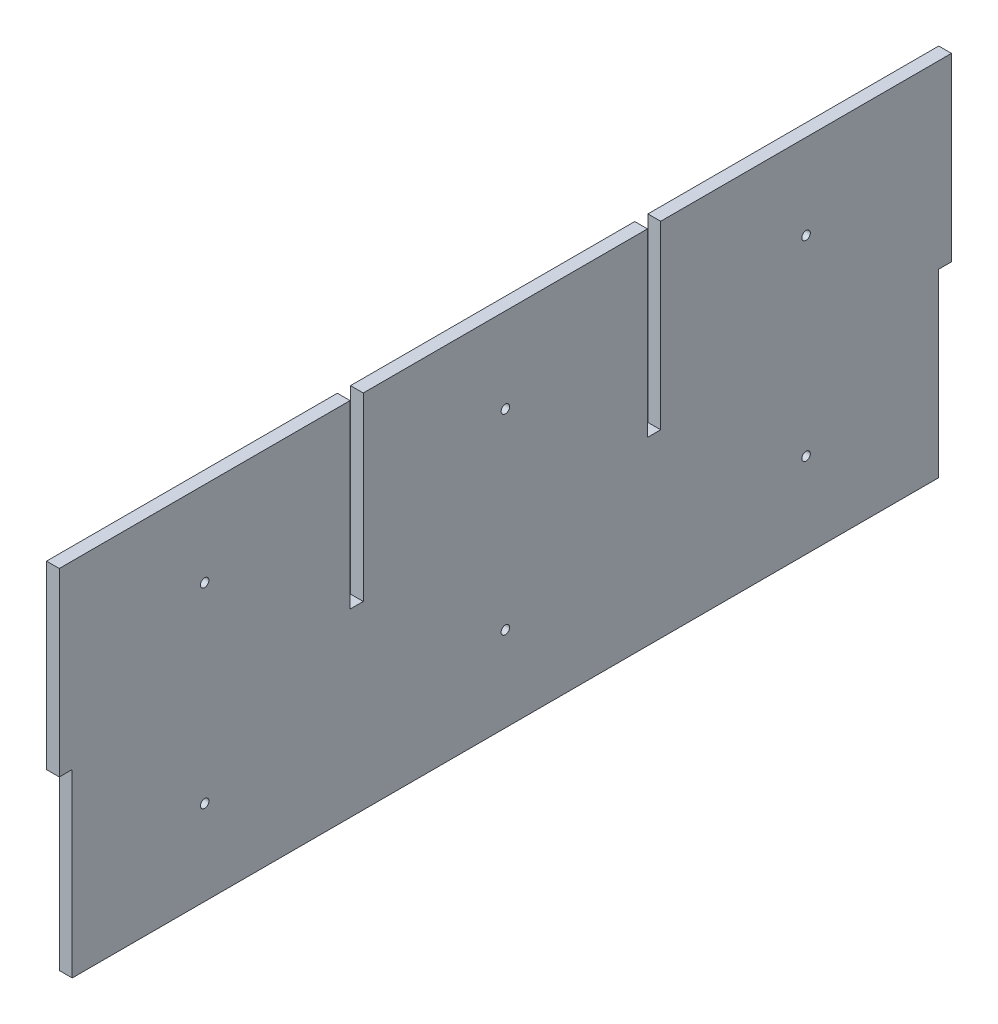
ISO-10303-21;
HEADER;
FILE_DESCRIPTION(('STEP AP214'),'2;1');
FILE_NAME('part.step','',(''),(''),'','','');
FILE_SCHEMA(('AUTOMOTIVE_DESIGN { 1 0 10303 214 1 1 1 1 }'));
ENDSEC;
DATA;
#1=APPLICATION_CONTEXT('core data for automotive mechanical design processes');
#2=APPLICATION_PROTOCOL_DEFINITION('international standard','automotive_design',2000,#1);
#3=PRODUCT_CONTEXT('',#1,'mechanical');
#4=PRODUCT('Part','Part','',(#3));
#5=PRODUCT_RELATED_PRODUCT_CATEGORY('part','',(#4));
#6=PRODUCT_DEFINITION_FORMATION('','',#4);
#7=PRODUCT_DEFINITION_CONTEXT('part definition',#1,'design');
#8=PRODUCT_DEFINITION('design','',#6,#7);
#9=PRODUCT_DEFINITION_SHAPE('','',#8);
#10=(LENGTH_UNIT() NAMED_UNIT(*) SI_UNIT(.MILLI.,.METRE.));
#11=(NAMED_UNIT(*) PLANE_ANGLE_UNIT() SI_UNIT($,.RADIAN.));
#12=(NAMED_UNIT(*) SI_UNIT($,.STERADIAN.) SOLID_ANGLE_UNIT());
#13=UNCERTAINTY_MEASURE_WITH_UNIT(LENGTH_MEASURE(1.E-05),#10,'distance_accuracy_value','');
#14=(GEOMETRIC_REPRESENTATION_CONTEXT(3) GLOBAL_UNCERTAINTY_ASSIGNED_CONTEXT((#13)) GLOBAL_UNIT_ASSIGNED_CONTEXT((#10,
#11,#12)) REPRESENTATION_CONTEXT('',''));
#15=CARTESIAN_POINT('',(0.,0.,0.));
#16=DIRECTION('',(0.,0.,1.));
#17=DIRECTION('',(1.,0.,0.));
#18=AXIS2_PLACEMENT_3D('',#15,#16,#17);
#19=CARTESIAN_POINT('',(6.,246.915861829284,-230.911700257926));
#20=DIRECTION('',(0.,-1.,0.));
#21=DIRECTION('',(0.,0.,-1.));
#22=AXIS2_PLACEMENT_3D('',#19,#20,#21);
#23=PLANE('',#22);
#24=DIRECTION('',(0.,0.,1.));
#25=VECTOR('',#24,1.);
#26=CARTESIAN_POINT('',(6.,246.915861829284,-230.911700257926));
#27=LINE('',#26,#25);
#28=CARTESIAN_POINT('',(6.,246.915861829284,-367.811700257926));
#29=VERTEX_POINT('',#28);
#30=CARTESIAN_POINT('',(6.,246.915861829284,-230.911700257926));
#31=VERTEX_POINT('',#30);
#32=EDGE_CURVE('E188',#29,#31,#27,.T.);
#33=ORIENTED_EDGE('',*,*,#32,.F.);
#34=DIRECTION('',(1.,0.,0.));
#35=VECTOR('',#34,1.);
#36=CARTESIAN_POINT('',(0.,246.915861829284,-367.811700257926));
#37=LINE('',#36,#35);
#38=CARTESIAN_POINT('',(0.,246.915861829284,-367.811700257926));
#39=VERTEX_POINT('',#38);
#40=EDGE_CURVE('E255',#39,#29,#37,.T.);
#41=ORIENTED_EDGE('',*,*,#40,.F.);
#42=DIRECTION('',(0.,0.,1.));
#43=VECTOR('',#42,1.);
#44=CARTESIAN_POINT('',(0.,246.915861829284,-230.911700257926));
#45=LINE('',#44,#43);
#46=CARTESIAN_POINT('',(0.,246.915861829284,-230.911700257926));
#47=VERTEX_POINT('',#46);
#48=EDGE_CURVE('E168',#39,#47,#45,.T.);
#49=ORIENTED_EDGE('',*,*,#48,.T.);
#50=DIRECTION('',(-1.,0.,0.));
#51=VECTOR('',#50,1.);
#52=CARTESIAN_POINT('',(6.,246.915861829284,-230.911700257926));
#53=LINE('',#52,#51);
#54=EDGE_CURVE('E41',#31,#47,#53,.T.);
#55=ORIENTED_EDGE('',*,*,#54,.F.);
#56=EDGE_LOOP('',(#33,#41,#49,#55));
#57=FACE_BOUND('',#56,.T.);
#58=ADVANCED_FACE('F33',(#57),#23,.F.);
#59=CARTESIAN_POINT('',(0.,246.915861829284,-650.911700257926));
#60=VERTEX_POINT('',#59);
#61=CARTESIAN_POINT('',(0.,246.915861829284,-514.011700257926));
#62=VERTEX_POINT('',#61);
#63=EDGE_CURVE('E167',#60,#62,#45,.T.);
#64=ORIENTED_EDGE('',*,*,#63,.T.);
#65=DIRECTION('',(1.,0.,0.));
#66=VECTOR('',#65,1.);
#67=CARTESIAN_POINT('',(0.,246.915861829284,-514.011700257926));
#68=LINE('',#67,#66);
#69=CARTESIAN_POINT('',(6.,246.915861829284,-514.011700257926));
#70=VERTEX_POINT('',#69);
#71=EDGE_CURVE('E221',#62,#70,#68,.T.);
#72=ORIENTED_EDGE('',*,*,#71,.T.);
#73=CARTESIAN_POINT('',(6.,246.915861829284,-650.911700257926));
#74=VERTEX_POINT('',#73);
#75=EDGE_CURVE('E179',#74,#70,#27,.T.);
#76=ORIENTED_EDGE('',*,*,#75,.F.);
#77=DIRECTION('',(-1.,0.,0.));
#78=VECTOR('',#77,1.);
#79=CARTESIAN_POINT('',(6.,246.915861829284,-650.911700257926));
#80=LINE('',#79,#78);
#81=EDGE_CURVE('E11',#74,#60,#80,.T.);
#82=ORIENTED_EDGE('',*,*,#81,.T.);
#83=EDGE_LOOP('',(#64,#72,#76,#82));
#84=FACE_BOUND('',#83,.T.);
#85=ADVANCED_FACE('F374',(#84),#23,.F.);
#86=CARTESIAN_POINT('',(6.,76.915861829284,-230.911700257926));
#87=DIRECTION('',(0.,0.,-1.));
#88=DIRECTION('',(-1.,0.,0.));
#89=AXIS2_PLACEMENT_3D('',#86,#87,#88);
#90=PLANE('',#89);
#91=DIRECTION('',(0.,-1.,0.));
#92=VECTOR('',#91,1.);
#93=CARTESIAN_POINT('',(0.,76.915861829284,-230.911700257926));
#94=LINE('',#93,#92);
#95=CARTESIAN_POINT('',(0.,161.915861829284,-230.911700257926));
#96=VERTEX_POINT('',#95);
#97=EDGE_CURVE('E174',#47,#96,#94,.T.);
#98=ORIENTED_EDGE('',*,*,#97,.T.);
#99=DIRECTION('',(1.,0.,0.));
#100=VECTOR('',#99,1.);
#101=CARTESIAN_POINT('',(0.,161.915861829284,-230.911700257926));
#102=LINE('',#101,#100);
#103=CARTESIAN_POINT('',(6.,161.915861829284,-230.911700257926));
#104=VERTEX_POINT('',#103);
#105=EDGE_CURVE('E207',#96,#104,#102,.T.);
#106=ORIENTED_EDGE('',*,*,#105,.T.);
#107=DIRECTION('',(0.,-1.,0.));
#108=VECTOR('',#107,1.);
#109=CARTESIAN_POINT('',(6.,76.915861829284,-230.911700257926));
#110=LINE('',#109,#108);
#111=EDGE_CURVE('E177',#31,#104,#110,.T.);
#112=ORIENTED_EDGE('',*,*,#111,.F.);
#113=ORIENTED_EDGE('',*,*,#54,.T.);
#114=EDGE_LOOP('',(#98,#106,#112,#113));
#115=FACE_BOUND('',#114,.T.);
#116=ADVANCED_FACE('F35',(#115),#90,.F.);
#117=CARTESIAN_POINT('',(6.,76.915861829284,-230.911700257926));
#118=DIRECTION('',(0.,1.,0.));
#119=DIRECTION('',(0.,0.,1.));
#120=AXIS2_PLACEMENT_3D('',#117,#118,#119);
#121=PLANE('',#120);
#122=DIRECTION('',(0.,0.,-1.));
#123=VECTOR('',#122,1.);
#124=CARTESIAN_POINT('',(0.,76.915861829284,-230.911700257926));
#125=LINE('',#124,#123);
#126=CARTESIAN_POINT('',(0.,76.915861829284,-237.011700257926));
#127=VERTEX_POINT('',#126);
#128=CARTESIAN_POINT('',(0.,76.915861829284,-644.811700257926));
#129=VERTEX_POINT('',#128);
#130=EDGE_CURVE('E169',#127,#129,#125,.T.);
#131=ORIENTED_EDGE('',*,*,#130,.T.);
#132=DIRECTION('',(1.,0.,0.));
#133=VECTOR('',#132,1.);
#134=CARTESIAN_POINT('',(0.,76.915861829284,-644.811700257926));
#135=LINE('',#134,#133);
#136=CARTESIAN_POINT('',(6.,76.915861829284,-644.811700257926));
#137=VERTEX_POINT('',#136);
#138=EDGE_CURVE('E216',#129,#137,#135,.T.);
#139=ORIENTED_EDGE('',*,*,#138,.T.);
#140=DIRECTION('',(0.,0.,-1.));
#141=VECTOR('',#140,1.);
#142=CARTESIAN_POINT('',(6.,76.915861829284,-230.911700257926));
#143=LINE('',#142,#141);
#144=CARTESIAN_POINT('',(6.,76.915861829284,-237.011700257926));
#145=VERTEX_POINT('',#144);
#146=EDGE_CURVE('E197',#145,#137,#143,.T.);
#147=ORIENTED_EDGE('',*,*,#146,.F.);
#148=DIRECTION('',(1.,0.,0.));
#149=VECTOR('',#148,1.);
#150=CARTESIAN_POINT('',(0.,76.915861829284,-237.011700257926));
#151=LINE('',#150,#149);
#152=EDGE_CURVE('E202',#127,#145,#151,.T.);
#153=ORIENTED_EDGE('',*,*,#152,.F.);
#154=EDGE_LOOP('',(#131,#139,#147,#153));
#155=FACE_BOUND('',#154,.T.);
#156=ADVANCED_FACE('F341',(#155),#121,.F.);
#157=CARTESIAN_POINT('',(6.,76.915861829284,-650.911700257926));
#158=DIRECTION('',(0.,0.,1.));
#159=DIRECTION('',(1.,0.,0.));
#160=AXIS2_PLACEMENT_3D('',#157,#158,#159);
#161=PLANE('',#160);
#162=DIRECTION('',(0.,1.,0.));
#163=VECTOR('',#162,1.);
#164=CARTESIAN_POINT('',(6.,76.915861829284,-650.911700257926));
#165=LINE('',#164,#163);
#166=CARTESIAN_POINT('',(6.,161.915861829284,-650.911700257926));
#167=VERTEX_POINT('',#166);
#168=EDGE_CURVE('E161',#167,#74,#165,.T.);
#169=ORIENTED_EDGE('',*,*,#168,.F.);
#170=DIRECTION('',(1.,0.,0.));
#171=VECTOR('',#170,1.);
#172=CARTESIAN_POINT('',(0.,161.915861829284,-650.911700257926));
#173=LINE('',#172,#171);
#174=CARTESIAN_POINT('',(0.,161.915861829284,-650.911700257926));
#175=VERTEX_POINT('',#174);
#176=EDGE_CURVE('E149',#175,#167,#173,.T.);
#177=ORIENTED_EDGE('',*,*,#176,.F.);
#178=DIRECTION('',(0.,1.,0.));
#179=VECTOR('',#178,1.);
#180=CARTESIAN_POINT('',(0.,76.915861829284,-650.911700257926));
#181=LINE('',#180,#179);
#182=EDGE_CURVE('E160',#175,#60,#181,.T.);
#183=ORIENTED_EDGE('',*,*,#182,.T.);
#184=ORIENTED_EDGE('',*,*,#81,.F.);
#185=EDGE_LOOP('',(#169,#177,#183,#184));
#186=FACE_BOUND('',#185,.T.);
#187=ADVANCED_FACE('F158',(#186),#161,.F.);
#188=CARTESIAN_POINT('',(0.,246.915861829284,-507.811700257926));
#189=VERTEX_POINT('',#188);
#190=CARTESIAN_POINT('',(0.,246.915861829284,-374.011700257926));
#191=VERTEX_POINT('',#190);
#192=EDGE_CURVE('E171',#189,#191,#45,.T.);
#193=ORIENTED_EDGE('',*,*,#192,.T.);
#194=DIRECTION('',(1.,0.,0.));
#195=VECTOR('',#194,1.);
#196=CARTESIAN_POINT('',(0.,246.915861829284,-374.011700257926));
#197=LINE('',#196,#195);
#198=CARTESIAN_POINT('',(6.,246.915861829284,-374.011700257926));
#199=VERTEX_POINT('',#198);
#200=EDGE_CURVE('E252',#191,#199,#197,.T.);
#201=ORIENTED_EDGE('',*,*,#200,.T.);
#202=CARTESIAN_POINT('',(6.,246.915861829284,-507.811700257926));
#203=VERTEX_POINT('',#202);
#204=EDGE_CURVE('E186',#203,#199,#27,.T.);
#205=ORIENTED_EDGE('',*,*,#204,.F.);
#206=DIRECTION('',(1.,0.,0.));
#207=VECTOR('',#206,1.);
#208=CARTESIAN_POINT('',(0.,246.915861829284,-507.811700257926));
#209=LINE('',#208,#207);
#210=EDGE_CURVE('E224',#189,#203,#209,.T.);
#211=ORIENTED_EDGE('',*,*,#210,.F.);
#212=EDGE_LOOP('',(#193,#201,#205,#211));
#213=FACE_BOUND('',#212,.T.);
#214=ADVANCED_FACE('F327',(#213),#23,.F.);
#215=CARTESIAN_POINT('',(6.,0.,0.));
#216=DIRECTION('',(-1.,0.,0.));
#217=DIRECTION('',(0.,0.,1.));
#218=AXIS2_PLACEMENT_3D('',#215,#216,#217);
#219=PLANE('',#218);
#220=CARTESIAN_POINT('',(6.,116.915861829284,-440.911700257926));
#221=DIRECTION('',(1.,0.,0.));
#222=DIRECTION('',(0.,0.,-1.));
#223=AXIS2_PLACEMENT_3D('',#220,#221,#222);
#224=CIRCLE('',#223,2.);
#225=CARTESIAN_POINT('',(6.,116.915861829284,-442.911700257926));
#226=VERTEX_POINT('',#225);
#227=EDGE_CURVE('E296',#226,#226,#224,.T.);
#228=ORIENTED_EDGE('',*,*,#227,.F.);
#229=EDGE_LOOP('',(#228));
#230=FACE_BOUND('',#229,.T.);
#231=CARTESIAN_POINT('',(6.,116.915861829284,-582.461700257926));
#232=DIRECTION('',(1.,0.,0.));
#233=DIRECTION('',(0.,0.,-1.));
#234=AXIS2_PLACEMENT_3D('',#231,#232,#233);
#235=CIRCLE('',#234,2.);
#236=CARTESIAN_POINT('',(6.,116.915861829284,-584.461700257926));
#237=VERTEX_POINT('',#236);
#238=EDGE_CURVE('E302',#237,#237,#235,.T.);
#239=ORIENTED_EDGE('',*,*,#238,.F.);
#240=EDGE_LOOP('',(#239));
#241=FACE_BOUND('',#240,.T.);
#242=CARTESIAN_POINT('',(6.,206.915861829284,-582.461700257926));
#243=DIRECTION('',(1.,0.,0.));
#244=DIRECTION('',(0.,0.,-1.));
#245=AXIS2_PLACEMENT_3D('',#242,#243,#244);
#246=CIRCLE('',#245,2.);
#247=CARTESIAN_POINT('',(6.,206.915861829284,-584.461700257926));
#248=VERTEX_POINT('',#247);
#249=EDGE_CURVE('E308',#248,#248,#246,.T.);
#250=ORIENTED_EDGE('',*,*,#249,.F.);
#251=EDGE_LOOP('',(#250));
#252=FACE_BOUND('',#251,.T.);
#253=CARTESIAN_POINT('',(6.,206.915861829284,-440.911700257926));
#254=DIRECTION('',(1.,0.,0.));
#255=DIRECTION('',(0.,0.,-1.));
#256=AXIS2_PLACEMENT_3D('',#253,#254,#255);
#257=CIRCLE('',#256,2.);
#258=CARTESIAN_POINT('',(6.,206.915861829284,-442.911700257926));
#259=VERTEX_POINT('',#258);
#260=EDGE_CURVE('E284',#259,#259,#257,.T.);
#261=ORIENTED_EDGE('',*,*,#260,.F.);
#262=EDGE_LOOP('',(#261));
#263=FACE_BOUND('',#262,.T.);
#264=CARTESIAN_POINT('',(6.,116.915861829284,-299.361700257926));
#265=DIRECTION('',(1.,0.,0.));
#266=DIRECTION('',(0.,0.,-1.));
#267=AXIS2_PLACEMENT_3D('',#264,#265,#266);
#268=CIRCLE('',#267,2.);
#269=CARTESIAN_POINT('',(6.,116.915861829284,-301.361700257926));
#270=VERTEX_POINT('',#269);
#271=EDGE_CURVE('E291',#270,#270,#268,.T.);
#272=ORIENTED_EDGE('',*,*,#271,.F.);
#273=EDGE_LOOP('',(#272));
#274=FACE_BOUND('',#273,.T.);
#275=CARTESIAN_POINT('',(6.,206.915861829284,-299.361700257926));
#276=DIRECTION('',(1.,0.,0.));
#277=DIRECTION('',(0.,0.,-1.));
#278=AXIS2_PLACEMENT_3D('',#275,#276,#277);
#279=CIRCLE('',#278,2.);
#280=CARTESIAN_POINT('',(6.,206.915861829284,-301.361700257926));
#281=VERTEX_POINT('',#280);
#282=EDGE_CURVE('E278',#281,#281,#279,.T.);
#283=ORIENTED_EDGE('',*,*,#282,.F.);
#284=EDGE_LOOP('',(#283));
#285=FACE_BOUND('',#284,.T.);
#286=ORIENTED_EDGE('',*,*,#146,.T.);
#287=DIRECTION('',(0.,-1.,0.));
#288=VECTOR('',#287,1.);
#289=CARTESIAN_POINT('',(6.,161.915861829284,-644.811700257926));
#290=LINE('',#289,#288);
#291=CARTESIAN_POINT('',(6.,161.915861829284,-644.811700257926));
#292=VERTEX_POINT('',#291);
#293=EDGE_CURVE('E154',#292,#137,#290,.T.);
#294=ORIENTED_EDGE('',*,*,#293,.F.);
#295=DIRECTION('',(0.,0.,1.));
#296=VECTOR('',#295,1.);
#297=CARTESIAN_POINT('',(6.,161.915861829284,-650.911700257926));
#298=LINE('',#297,#296);
#299=EDGE_CURVE('E257',#167,#292,#298,.T.);
#300=ORIENTED_EDGE('',*,*,#299,.F.);
#301=ORIENTED_EDGE('',*,*,#168,.T.);
#302=ORIENTED_EDGE('',*,*,#75,.T.);
#303=DIRECTION('',(0.,1.,0.));
#304=VECTOR('',#303,1.);
#305=CARTESIAN_POINT('',(6.,246.915861829284,-514.011700257926));
#306=LINE('',#305,#304);
#307=CARTESIAN_POINT('',(6.,161.915861829284,-514.011700257926));
#308=VERTEX_POINT('',#307);
#309=EDGE_CURVE('E239',#308,#70,#306,.T.);
#310=ORIENTED_EDGE('',*,*,#309,.F.);
#311=DIRECTION('',(0.,0.,-1.));
#312=VECTOR('',#311,1.);
#313=CARTESIAN_POINT('',(6.,161.915861829284,-514.011700257926));
#314=LINE('',#313,#312);
#315=CARTESIAN_POINT('',(6.,161.915861829284,-507.811700257926));
#316=VERTEX_POINT('',#315);
#317=EDGE_CURVE('E232',#316,#308,#314,.T.);
#318=ORIENTED_EDGE('',*,*,#317,.F.);
#319=DIRECTION('',(0.,-1.,0.));
#320=VECTOR('',#319,1.);
#321=CARTESIAN_POINT('',(6.,246.915861829284,-507.811700257926));
#322=LINE('',#321,#320);
#323=EDGE_CURVE('E236',#203,#316,#322,.T.);
#324=ORIENTED_EDGE('',*,*,#323,.F.);
#325=ORIENTED_EDGE('',*,*,#204,.T.);
#326=DIRECTION('',(0.,1.,0.));
#327=VECTOR('',#326,1.);
#328=CARTESIAN_POINT('',(6.,246.915861829284,-374.011700257926));
#329=LINE('',#328,#327);
#330=CARTESIAN_POINT('',(6.,161.915861829284,-374.011700257926));
#331=VERTEX_POINT('',#330);
#332=EDGE_CURVE('E258',#331,#199,#329,.T.);
#333=ORIENTED_EDGE('',*,*,#332,.F.);
#334=DIRECTION('',(0.,0.,-1.));
#335=VECTOR('',#334,1.);
#336=CARTESIAN_POINT('',(6.,161.915861829284,-367.811700257926));
#337=LINE('',#336,#335);
#338=CARTESIAN_POINT('',(6.,161.915861829284,-367.811700257926));
#339=VERTEX_POINT('',#338);
#340=EDGE_CURVE('E261',#339,#331,#337,.T.);
#341=ORIENTED_EDGE('',*,*,#340,.F.);
#342=DIRECTION('',(0.,-1.,0.));
#343=VECTOR('',#342,1.);
#344=CARTESIAN_POINT('',(6.,246.915861829284,-367.811700257926));
#345=LINE('',#344,#343);
#346=EDGE_CURVE('E231',#29,#339,#345,.T.);
#347=ORIENTED_EDGE('',*,*,#346,.F.);
#348=ORIENTED_EDGE('',*,*,#32,.T.);
#349=ORIENTED_EDGE('',*,*,#111,.T.);
#350=DIRECTION('',(0.,0.,1.));
#351=VECTOR('',#350,1.);
#352=CARTESIAN_POINT('',(6.,161.915861829284,-230.911700257926));
#353=LINE('',#352,#351);
#354=CARTESIAN_POINT('',(6.,161.915861829284,-237.011700257926));
#355=VERTEX_POINT('',#354);
#356=EDGE_CURVE('E210',#355,#104,#353,.T.);
#357=ORIENTED_EDGE('',*,*,#356,.F.);
#358=DIRECTION('',(0.,1.,0.));
#359=VECTOR('',#358,1.);
#360=CARTESIAN_POINT('',(6.,161.915861829284,-237.011700257926));
#361=LINE('',#360,#359);
#362=EDGE_CURVE('E213',#145,#355,#361,.T.);
#363=ORIENTED_EDGE('',*,*,#362,.F.);
#364=EDGE_LOOP('',(#286,#294,#300,#301,#302,#310,#318,#324,#325,#333,#341,#347,#348,#349,#357,#363));
#365=FACE_BOUND('',#364,.T.);
#366=ADVANCED_FACE('F324',(#230,#241,#252,#263,#274,#285,#365),#219,.F.);
#367=CARTESIAN_POINT('',(0.,0.,0.));
#368=DIRECTION('',(-1.,0.,0.));
#369=DIRECTION('',(0.,0.,1.));
#370=AXIS2_PLACEMENT_3D('',#367,#368,#369);
#371=PLANE('',#370);
#372=CARTESIAN_POINT('',(0.,116.915861829284,-440.911700257926));
#373=DIRECTION('',(1.,0.,0.));
#374=DIRECTION('',(0.,0.,-1.));
#375=AXIS2_PLACEMENT_3D('',#372,#373,#374);
#376=CIRCLE('',#375,2.);
#377=CARTESIAN_POINT('',(0.,116.915861829284,-442.911700257926));
#378=VERTEX_POINT('',#377);
#379=EDGE_CURVE('E299',#378,#378,#376,.T.);
#380=ORIENTED_EDGE('',*,*,#379,.T.);
#381=EDGE_LOOP('',(#380));
#382=FACE_BOUND('',#381,.T.);
#383=CARTESIAN_POINT('',(0.,116.915861829284,-582.461700257926));
#384=DIRECTION('',(1.,0.,0.));
#385=DIRECTION('',(0.,0.,-1.));
#386=AXIS2_PLACEMENT_3D('',#383,#384,#385);
#387=CIRCLE('',#386,2.);
#388=CARTESIAN_POINT('',(0.,116.915861829284,-584.461700257926));
#389=VERTEX_POINT('',#388);
#390=EDGE_CURVE('E305',#389,#389,#387,.T.);
#391=ORIENTED_EDGE('',*,*,#390,.T.);
#392=EDGE_LOOP('',(#391));
#393=FACE_BOUND('',#392,.T.);
#394=CARTESIAN_POINT('',(0.,206.915861829284,-582.461700257926));
#395=DIRECTION('',(1.,0.,0.));
#396=DIRECTION('',(0.,0.,-1.));
#397=AXIS2_PLACEMENT_3D('',#394,#395,#396);
#398=CIRCLE('',#397,2.);
#399=CARTESIAN_POINT('',(0.,206.915861829284,-584.461700257926));
#400=VERTEX_POINT('',#399);
#401=EDGE_CURVE('E288',#400,#400,#398,.T.);
#402=ORIENTED_EDGE('',*,*,#401,.T.);
#403=EDGE_LOOP('',(#402));
#404=FACE_BOUND('',#403,.T.);
#405=CARTESIAN_POINT('',(0.,206.915861829284,-440.911700257926));
#406=DIRECTION('',(1.,0.,0.));
#407=DIRECTION('',(0.,0.,-1.));
#408=AXIS2_PLACEMENT_3D('',#405,#406,#407);
#409=CIRCLE('',#408,2.);
#410=CARTESIAN_POINT('',(0.,206.915861829284,-442.911700257926));
#411=VERTEX_POINT('',#410);
#412=EDGE_CURVE('E287',#411,#411,#409,.T.);
#413=ORIENTED_EDGE('',*,*,#412,.T.);
#414=EDGE_LOOP('',(#413));
#415=FACE_BOUND('',#414,.T.);
#416=CARTESIAN_POINT('',(0.,116.915861829284,-299.361700257926));
#417=DIRECTION('',(1.,0.,0.));
#418=DIRECTION('',(0.,0.,-1.));
#419=AXIS2_PLACEMENT_3D('',#416,#417,#418);
#420=CIRCLE('',#419,2.);
#421=CARTESIAN_POINT('',(0.,116.915861829284,-301.361700257926));
#422=VERTEX_POINT('',#421);
#423=EDGE_CURVE('E281',#422,#422,#420,.T.);
#424=ORIENTED_EDGE('',*,*,#423,.T.);
#425=EDGE_LOOP('',(#424));
#426=FACE_BOUND('',#425,.T.);
#427=CARTESIAN_POINT('',(0.,206.915861829284,-299.361700257926));
#428=DIRECTION('',(1.,0.,0.));
#429=DIRECTION('',(0.,0.,-1.));
#430=AXIS2_PLACEMENT_3D('',#427,#428,#429);
#431=CIRCLE('',#430,2.);
#432=CARTESIAN_POINT('',(0.,206.915861829284,-301.361700257926));
#433=VERTEX_POINT('',#432);
#434=EDGE_CURVE('E241',#433,#433,#431,.T.);
#435=ORIENTED_EDGE('',*,*,#434,.T.);
#436=EDGE_LOOP('',(#435));
#437=FACE_BOUND('',#436,.T.);
#438=DIRECTION('',(0.,-1.,0.));
#439=VECTOR('',#438,1.);
#440=CARTESIAN_POINT('',(0.,161.915861829284,-644.811700257926));
#441=LINE('',#440,#439);
#442=CARTESIAN_POINT('',(0.,161.915861829284,-644.811700257926));
#443=VERTEX_POINT('',#442);
#444=EDGE_CURVE('E48',#443,#129,#441,.T.);
#445=ORIENTED_EDGE('',*,*,#444,.T.);
#446=ORIENTED_EDGE('',*,*,#130,.F.);
#447=DIRECTION('',(0.,1.,0.));
#448=VECTOR('',#447,1.);
#449=CARTESIAN_POINT('',(0.,161.915861829284,-237.011700257926));
#450=LINE('',#449,#448);
#451=CARTESIAN_POINT('',(0.,161.915861829284,-237.011700257926));
#452=VERTEX_POINT('',#451);
#453=EDGE_CURVE('E212',#127,#452,#450,.T.);
#454=ORIENTED_EDGE('',*,*,#453,.T.);
#455=DIRECTION('',(0.,0.,1.));
#456=VECTOR('',#455,1.);
#457=CARTESIAN_POINT('',(0.,161.915861829284,-230.911700257926));
#458=LINE('',#457,#456);
#459=EDGE_CURVE('E205',#452,#96,#458,.T.);
#460=ORIENTED_EDGE('',*,*,#459,.T.);
#461=ORIENTED_EDGE('',*,*,#97,.F.);
#462=ORIENTED_EDGE('',*,*,#48,.F.);
#463=DIRECTION('',(0.,-1.,0.));
#464=VECTOR('',#463,1.);
#465=CARTESIAN_POINT('',(0.,246.915861829284,-367.811700257926));
#466=LINE('',#465,#464);
#467=CARTESIAN_POINT('',(0.,161.915861829284,-367.811700257926));
#468=VERTEX_POINT('',#467);
#469=EDGE_CURVE('E260',#39,#468,#466,.T.);
#470=ORIENTED_EDGE('',*,*,#469,.T.);
#471=DIRECTION('',(0.,0.,-1.));
#472=VECTOR('',#471,1.);
#473=CARTESIAN_POINT('',(0.,161.915861829284,-367.811700257926));
#474=LINE('',#473,#472);
#475=CARTESIAN_POINT('',(0.,161.915861829284,-374.011700257926));
#476=VERTEX_POINT('',#475);
#477=EDGE_CURVE('E267',#468,#476,#474,.T.);
#478=ORIENTED_EDGE('',*,*,#477,.T.);
#479=DIRECTION('',(0.,1.,0.));
#480=VECTOR('',#479,1.);
#481=CARTESIAN_POINT('',(0.,246.915861829284,-374.011700257926));
#482=LINE('',#481,#480);
#483=EDGE_CURVE('E56',#476,#191,#482,.T.);
#484=ORIENTED_EDGE('',*,*,#483,.T.);
#485=ORIENTED_EDGE('',*,*,#192,.F.);
#486=DIRECTION('',(0.,-1.,0.));
#487=VECTOR('',#486,1.);
#488=CARTESIAN_POINT('',(0.,246.915861829284,-507.811700257926));
#489=LINE('',#488,#487);
#490=CARTESIAN_POINT('',(0.,161.915861829284,-507.811700257926));
#491=VERTEX_POINT('',#490);
#492=EDGE_CURVE('E244',#189,#491,#489,.T.);
#493=ORIENTED_EDGE('',*,*,#492,.T.);
#494=DIRECTION('',(0.,0.,-1.));
#495=VECTOR('',#494,1.);
#496=CARTESIAN_POINT('',(0.,161.915861829284,-514.011700257926));
#497=LINE('',#496,#495);
#498=CARTESIAN_POINT('',(0.,161.915861829284,-514.011700257926));
#499=VERTEX_POINT('',#498);
#500=EDGE_CURVE('E225',#491,#499,#497,.T.);
#501=ORIENTED_EDGE('',*,*,#500,.T.);
#502=DIRECTION('',(0.,1.,0.));
#503=VECTOR('',#502,1.);
#504=CARTESIAN_POINT('',(0.,246.915861829284,-514.011700257926));
#505=LINE('',#504,#503);
#506=EDGE_CURVE('E235',#499,#62,#505,.T.);
#507=ORIENTED_EDGE('',*,*,#506,.T.);
#508=ORIENTED_EDGE('',*,*,#63,.F.);
#509=ORIENTED_EDGE('',*,*,#182,.F.);
#510=DIRECTION('',(0.,0.,1.));
#511=VECTOR('',#510,1.);
#512=CARTESIAN_POINT('',(0.,161.915861829284,-650.911700257926));
#513=LINE('',#512,#511);
#514=EDGE_CURVE('E145',#175,#443,#513,.T.);
#515=ORIENTED_EDGE('',*,*,#514,.T.);
#516=EDGE_LOOP('',(#445,#446,#454,#460,#461,#462,#470,#478,#484,#485,#493,#501,#507,#508,#509,#515));
#517=FACE_BOUND('',#516,.T.);
#518=ADVANCED_FACE('F164',(#382,#393,#404,#415,#426,#437,#517),#371,.T.);
#519=CARTESIAN_POINT('',(0.,161.915861829284,-230.911700257926));
#520=DIRECTION('',(0.,1.,0.));
#521=DIRECTION('',(0.,0.,1.));
#522=AXIS2_PLACEMENT_3D('',#519,#520,#521);
#523=PLANE('',#522);
#524=ORIENTED_EDGE('',*,*,#356,.T.);
#525=ORIENTED_EDGE('',*,*,#105,.F.);
#526=ORIENTED_EDGE('',*,*,#459,.F.);
#527=DIRECTION('',(1.,0.,0.));
#528=VECTOR('',#527,1.);
#529=CARTESIAN_POINT('',(0.,161.915861829284,-237.011700257926));
#530=LINE('',#529,#528);
#531=EDGE_CURVE('E204',#452,#355,#530,.T.);
#532=ORIENTED_EDGE('',*,*,#531,.T.);
#533=EDGE_LOOP('',(#524,#525,#526,#532));
#534=FACE_BOUND('',#533,.T.);
#535=ADVANCED_FACE('F348',(#534),#523,.F.);
#536=CARTESIAN_POINT('',(0.,161.915861829284,-237.011700257926));
#537=DIRECTION('',(0.,0.,-1.));
#538=DIRECTION('',(0.,1.,0.));
#539=AXIS2_PLACEMENT_3D('',#536,#537,#538);
#540=PLANE('',#539);
#541=ORIENTED_EDGE('',*,*,#362,.T.);
#542=ORIENTED_EDGE('',*,*,#531,.F.);
#543=ORIENTED_EDGE('',*,*,#453,.F.);
#544=ORIENTED_EDGE('',*,*,#152,.T.);
#545=EDGE_LOOP('',(#541,#542,#543,#544));
#546=FACE_BOUND('',#545,.T.);
#547=ADVANCED_FACE('F346',(#546),#540,.F.);
#548=CARTESIAN_POINT('',(0.,246.915861829284,-514.011700257926));
#549=DIRECTION('',(0.,0.,-1.));
#550=DIRECTION('',(0.,1.,0.));
#551=AXIS2_PLACEMENT_3D('',#548,#549,#550);
#552=PLANE('',#551);
#553=ORIENTED_EDGE('',*,*,#309,.T.);
#554=ORIENTED_EDGE('',*,*,#71,.F.);
#555=ORIENTED_EDGE('',*,*,#506,.F.);
#556=DIRECTION('',(1.,0.,0.));
#557=VECTOR('',#556,1.);
#558=CARTESIAN_POINT('',(0.,161.915861829284,-514.011700257926));
#559=LINE('',#558,#557);
#560=EDGE_CURVE('E229',#499,#308,#559,.T.);
#561=ORIENTED_EDGE('',*,*,#560,.T.);
#562=EDGE_LOOP('',(#553,#554,#555,#561));
#563=FACE_BOUND('',#562,.T.);
#564=ADVANCED_FACE('F375',(#563),#552,.F.);
#565=CARTESIAN_POINT('',(0.,161.915861829284,-514.011700257926));
#566=DIRECTION('',(0.,-1.,0.));
#567=DIRECTION('',(0.,0.,-1.));
#568=AXIS2_PLACEMENT_3D('',#565,#566,#567);
#569=PLANE('',#568);
#570=ORIENTED_EDGE('',*,*,#317,.T.);
#571=ORIENTED_EDGE('',*,*,#560,.F.);
#572=ORIENTED_EDGE('',*,*,#500,.F.);
#573=DIRECTION('',(1.,0.,0.));
#574=VECTOR('',#573,1.);
#575=CARTESIAN_POINT('',(0.,161.915861829284,-507.811700257926));
#576=LINE('',#575,#574);
#577=EDGE_CURVE('E227',#491,#316,#576,.T.);
#578=ORIENTED_EDGE('',*,*,#577,.T.);
#579=EDGE_LOOP('',(#570,#571,#572,#578));
#580=FACE_BOUND('',#579,.T.);
#581=ADVANCED_FACE('F370',(#580),#569,.F.);
#582=CARTESIAN_POINT('',(0.,246.915861829284,-507.811700257926));
#583=DIRECTION('',(0.,0.,1.));
#584=DIRECTION('',(0.,-1.,0.));
#585=AXIS2_PLACEMENT_3D('',#582,#583,#584);
#586=PLANE('',#585);
#587=ORIENTED_EDGE('',*,*,#323,.T.);
#588=ORIENTED_EDGE('',*,*,#577,.F.);
#589=ORIENTED_EDGE('',*,*,#492,.F.);
#590=ORIENTED_EDGE('',*,*,#210,.T.);
#591=EDGE_LOOP('',(#587,#588,#589,#590));
#592=FACE_BOUND('',#591,.T.);
#593=ADVANCED_FACE('F366',(#592),#586,.F.);
#594=CARTESIAN_POINT('',(0.,246.915861829284,-367.811700257926));
#595=DIRECTION('',(0.,0.,1.));
#596=DIRECTION('',(1.,0.,0.));
#597=AXIS2_PLACEMENT_3D('',#594,#595,#596);
#598=PLANE('',#597);
#599=ORIENTED_EDGE('',*,*,#346,.T.);
#600=DIRECTION('',(1.,0.,0.));
#601=VECTOR('',#600,1.);
#602=CARTESIAN_POINT('',(0.,161.915861829284,-367.811700257926));
#603=LINE('',#602,#601);
#604=EDGE_CURVE('E248',#468,#339,#603,.T.);
#605=ORIENTED_EDGE('',*,*,#604,.F.);
#606=ORIENTED_EDGE('',*,*,#469,.F.);
#607=ORIENTED_EDGE('',*,*,#40,.T.);
#608=EDGE_LOOP('',(#599,#605,#606,#607));
#609=FACE_BOUND('',#608,.T.);
#610=ADVANCED_FACE('F353',(#609),#598,.F.);
#611=CARTESIAN_POINT('',(0.,246.915861829284,-374.011700257926));
#612=DIRECTION('',(0.,0.,-1.));
#613=DIRECTION('',(-1.,0.,0.));
#614=AXIS2_PLACEMENT_3D('',#611,#612,#613);
#615=PLANE('',#614);
#616=ORIENTED_EDGE('',*,*,#332,.T.);
#617=ORIENTED_EDGE('',*,*,#200,.F.);
#618=ORIENTED_EDGE('',*,*,#483,.F.);
#619=DIRECTION('',(1.,0.,0.));
#620=VECTOR('',#619,1.);
#621=CARTESIAN_POINT('',(0.,161.915861829284,-374.011700257926));
#622=LINE('',#621,#620);
#623=EDGE_CURVE('E250',#476,#331,#622,.T.);
#624=ORIENTED_EDGE('',*,*,#623,.T.);
#625=EDGE_LOOP('',(#616,#617,#618,#624));
#626=FACE_BOUND('',#625,.T.);
#627=ADVANCED_FACE('F450',(#626),#615,.F.);
#628=CARTESIAN_POINT('',(0.,161.915861829284,-367.811700257926));
#629=DIRECTION('',(0.,-1.,0.));
#630=DIRECTION('',(0.,0.,-1.));
#631=AXIS2_PLACEMENT_3D('',#628,#629,#630);
#632=PLANE('',#631);
#633=ORIENTED_EDGE('',*,*,#340,.T.);
#634=ORIENTED_EDGE('',*,*,#623,.F.);
#635=ORIENTED_EDGE('',*,*,#477,.F.);
#636=ORIENTED_EDGE('',*,*,#604,.T.);
#637=EDGE_LOOP('',(#633,#634,#635,#636));
#638=FACE_BOUND('',#637,.T.);
#639=ADVANCED_FACE('F357',(#638),#632,.F.);
#640=CARTESIAN_POINT('',(0.,161.915861829284,-644.811700257926));
#641=DIRECTION('',(0.,0.,1.));
#642=DIRECTION('',(1.,0.,0.));
#643=AXIS2_PLACEMENT_3D('',#640,#641,#642);
#644=PLANE('',#643);
#645=ORIENTED_EDGE('',*,*,#293,.T.);
#646=ORIENTED_EDGE('',*,*,#138,.F.);
#647=ORIENTED_EDGE('',*,*,#444,.F.);
#648=DIRECTION('',(1.,0.,0.));
#649=VECTOR('',#648,1.);
#650=CARTESIAN_POINT('',(0.,161.915861829284,-644.811700257926));
#651=LINE('',#650,#649);
#652=EDGE_CURVE('E151',#443,#292,#651,.T.);
#653=ORIENTED_EDGE('',*,*,#652,.T.);
#654=EDGE_LOOP('',(#645,#646,#647,#653));
#655=FACE_BOUND('',#654,.T.);
#656=ADVANCED_FACE('F343',(#655),#644,.F.);
#657=CARTESIAN_POINT('',(0.,161.915861829284,-650.911700257926));
#658=DIRECTION('',(0.,1.,0.));
#659=DIRECTION('',(0.,0.,1.));
#660=AXIS2_PLACEMENT_3D('',#657,#658,#659);
#661=PLANE('',#660);
#662=ORIENTED_EDGE('',*,*,#299,.T.);
#663=ORIENTED_EDGE('',*,*,#652,.F.);
#664=ORIENTED_EDGE('',*,*,#514,.F.);
#665=ORIENTED_EDGE('',*,*,#176,.T.);
#666=EDGE_LOOP('',(#662,#663,#664,#665));
#667=FACE_BOUND('',#666,.T.);
#668=ADVANCED_FACE('F148',(#667),#661,.F.);
#669=CARTESIAN_POINT('',(0.,206.915861829284,-299.361700257926));
#670=DIRECTION('',(1.,0.,0.));
#671=DIRECTION('',(0.,0.,-1.));
#672=AXIS2_PLACEMENT_3D('',#669,#670,#671);
#673=CYLINDRICAL_SURFACE('',#672,2.);
#674=ORIENTED_EDGE('',*,*,#434,.F.);
#675=EDGE_LOOP('',(#674));
#676=FACE_BOUND('',#675,.T.);
#677=ORIENTED_EDGE('',*,*,#282,.T.);
#678=EDGE_LOOP('',(#677));
#679=FACE_BOUND('',#678,.T.);
#680=ADVANCED_FACE('F479',(#676,#679),#673,.F.);
#681=CARTESIAN_POINT('',(0.,116.915861829284,-299.361700257926));
#682=DIRECTION('',(1.,0.,0.));
#683=DIRECTION('',(0.,0.,-1.));
#684=AXIS2_PLACEMENT_3D('',#681,#682,#683);
#685=CYLINDRICAL_SURFACE('',#684,2.);
#686=ORIENTED_EDGE('',*,*,#423,.F.);
#687=EDGE_LOOP('',(#686));
#688=FACE_BOUND('',#687,.T.);
#689=ORIENTED_EDGE('',*,*,#271,.T.);
#690=EDGE_LOOP('',(#689));
#691=FACE_BOUND('',#690,.T.);
#692=ADVANCED_FACE('F488',(#688,#691),#685,.F.);
#693=CARTESIAN_POINT('',(0.,206.915861829284,-440.911700257926));
#694=DIRECTION('',(1.,0.,0.));
#695=DIRECTION('',(0.,0.,-1.));
#696=AXIS2_PLACEMENT_3D('',#693,#694,#695);
#697=CYLINDRICAL_SURFACE('',#696,2.);
#698=ORIENTED_EDGE('',*,*,#412,.F.);
#699=EDGE_LOOP('',(#698));
#700=FACE_BOUND('',#699,.T.);
#701=ORIENTED_EDGE('',*,*,#260,.T.);
#702=EDGE_LOOP('',(#701));
#703=FACE_BOUND('',#702,.T.);
#704=ADVANCED_FACE('F320',(#700,#703),#697,.F.);
#705=CARTESIAN_POINT('',(0.,206.915861829284,-582.461700257926));
#706=DIRECTION('',(1.,0.,0.));
#707=DIRECTION('',(0.,0.,-1.));
#708=AXIS2_PLACEMENT_3D('',#705,#706,#707);
#709=CYLINDRICAL_SURFACE('',#708,2.);
#710=ORIENTED_EDGE('',*,*,#401,.F.);
#711=EDGE_LOOP('',(#710));
#712=FACE_BOUND('',#711,.T.);
#713=ORIENTED_EDGE('',*,*,#249,.T.);
#714=EDGE_LOOP('',(#713));
#715=FACE_BOUND('',#714,.T.);
#716=ADVANCED_FACE('F316',(#712,#715),#709,.F.);
#717=CARTESIAN_POINT('',(0.,116.915861829284,-582.461700257926));
#718=DIRECTION('',(1.,0.,0.));
#719=DIRECTION('',(0.,0.,-1.));
#720=AXIS2_PLACEMENT_3D('',#717,#718,#719);
#721=CYLINDRICAL_SURFACE('',#720,2.);
#722=ORIENTED_EDGE('',*,*,#390,.F.);
#723=EDGE_LOOP('',(#722));
#724=FACE_BOUND('',#723,.T.);
#725=ORIENTED_EDGE('',*,*,#238,.T.);
#726=EDGE_LOOP('',(#725));
#727=FACE_BOUND('',#726,.T.);
#728=ADVANCED_FACE('F319',(#724,#727),#721,.F.);
#729=CARTESIAN_POINT('',(0.,116.915861829284,-440.911700257926));
#730=DIRECTION('',(1.,0.,0.));
#731=DIRECTION('',(0.,0.,-1.));
#732=AXIS2_PLACEMENT_3D('',#729,#730,#731);
#733=CYLINDRICAL_SURFACE('',#732,2.);
#734=ORIENTED_EDGE('',*,*,#379,.F.);
#735=EDGE_LOOP('',(#734));
#736=FACE_BOUND('',#735,.T.);
#737=ORIENTED_EDGE('',*,*,#227,.T.);
#738=EDGE_LOOP('',(#737));
#739=FACE_BOUND('',#738,.T.);
#740=ADVANCED_FACE('F519',(#736,#739),#733,.F.);
#741=CLOSED_SHELL('',(#58,#85,#116,#156,#187,#214,#366,#518,#535,#547,#564,#581,#593,#610,#627,
#639,#656,#668,#680,#692,#704,#716,#728,#740));
#742=MANIFOLD_SOLID_BREP('B2',#741);
#743=ADVANCED_BREP_SHAPE_REPRESENTATION('',(#18,#742),#14);
#744=SHAPE_DEFINITION_REPRESENTATION(#9,#743);
ENDSEC;
END-ISO-10303-21;
